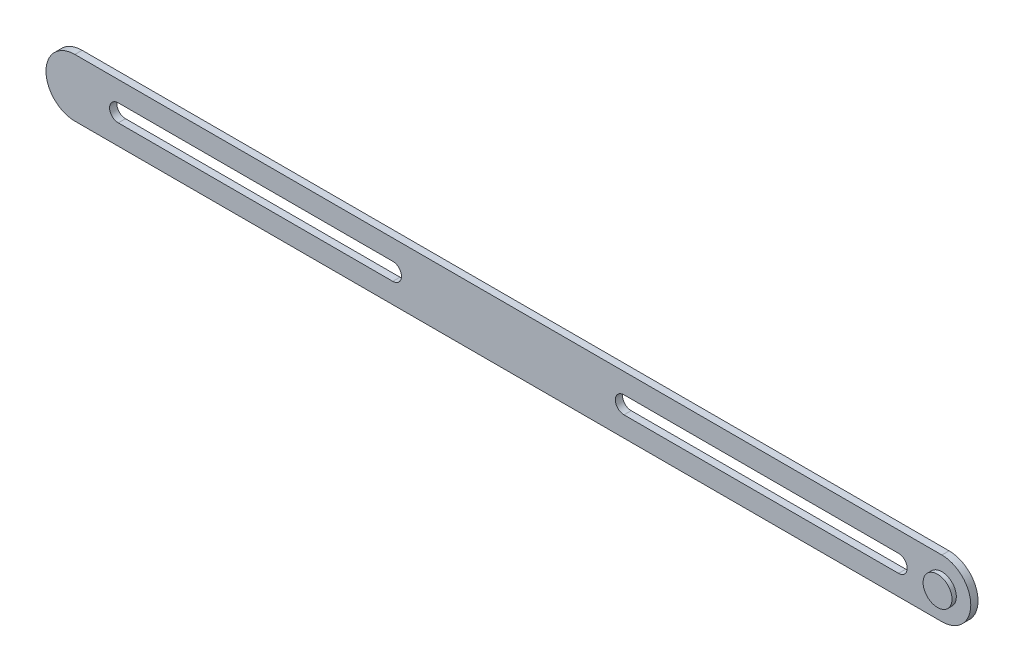
ISO-10303-21;
HEADER;
FILE_DESCRIPTION(('STEP AP214'),'2;1');
FILE_NAME('part.step','',(''),(''),'','','');
FILE_SCHEMA(('AUTOMOTIVE_DESIGN { 1 0 10303 214 1 1 1 1 }'));
ENDSEC;
DATA;
#1=APPLICATION_CONTEXT('core data for automotive mechanical design processes');
#2=APPLICATION_PROTOCOL_DEFINITION('international standard','automotive_design',2000,#1);
#3=PRODUCT_CONTEXT('',#1,'mechanical');
#4=PRODUCT('Part','Part','',(#3));
#5=PRODUCT_RELATED_PRODUCT_CATEGORY('part','',(#4));
#6=PRODUCT_DEFINITION_FORMATION('','',#4);
#7=PRODUCT_DEFINITION_CONTEXT('part definition',#1,'design');
#8=PRODUCT_DEFINITION('design','',#6,#7);
#9=PRODUCT_DEFINITION_SHAPE('','',#8);
#10=(LENGTH_UNIT() NAMED_UNIT(*) SI_UNIT(.MILLI.,.METRE.));
#11=(NAMED_UNIT(*) PLANE_ANGLE_UNIT() SI_UNIT($,.RADIAN.));
#12=(NAMED_UNIT(*) SI_UNIT($,.STERADIAN.) SOLID_ANGLE_UNIT());
#13=UNCERTAINTY_MEASURE_WITH_UNIT(LENGTH_MEASURE(1.E-05),#10,'distance_accuracy_value','');
#14=(GEOMETRIC_REPRESENTATION_CONTEXT(3) GLOBAL_UNCERTAINTY_ASSIGNED_CONTEXT((#13)) GLOBAL_UNIT_ASSIGNED_CONTEXT((#10,
#11,#12)) REPRESENTATION_CONTEXT('',''));
#15=CARTESIAN_POINT('',(0.,0.,0.));
#16=DIRECTION('',(0.,0.,1.));
#17=DIRECTION('',(1.,0.,0.));
#18=AXIS2_PLACEMENT_3D('',#15,#16,#17);
#19=CARTESIAN_POINT('',(0.,0.,4.));
#20=DIRECTION('',(0.,0.,-1.));
#21=DIRECTION('',(-1.,0.,0.));
#22=AXIS2_PLACEMENT_3D('',#19,#20,#21);
#23=CYLINDRICAL_SURFACE('',#22,2.5);
#24=CARTESIAN_POINT('',(0.,0.,4.));
#25=DIRECTION('',(0.,0.,1.));
#26=DIRECTION('',(1.,0.,0.));
#27=AXIS2_PLACEMENT_3D('',#24,#25,#26);
#28=CIRCLE('',#27,2.5);
#29=CARTESIAN_POINT('',(2.5,0.,4.));
#30=VERTEX_POINT('',#29);
#31=EDGE_CURVE('E41',#30,#30,#28,.T.);
#32=ORIENTED_EDGE('',*,*,#31,.F.);
#33=EDGE_LOOP('',(#32));
#34=FACE_BOUND('',#33,.T.);
#35=CARTESIAN_POINT('',(0.,0.,0.));
#36=DIRECTION('',(0.,0.,1.));
#37=DIRECTION('',(1.,0.,0.));
#38=AXIS2_PLACEMENT_3D('',#35,#36,#37);
#39=CIRCLE('',#38,2.5);
#40=CARTESIAN_POINT('',(2.5,0.,0.));
#41=VERTEX_POINT('',#40);
#42=EDGE_CURVE('E220',#41,#41,#39,.T.);
#43=ORIENTED_EDGE('',*,*,#42,.T.);
#44=EDGE_LOOP('',(#43));
#45=FACE_BOUND('',#44,.T.);
#46=ADVANCED_FACE('F33',(#34,#45),#23,.T.);
#47=CARTESIAN_POINT('',(0.,0.,0.));
#48=DIRECTION('',(0.,0.,1.));
#49=DIRECTION('',(1.,0.,0.));
#50=AXIS2_PLACEMENT_3D('',#47,#48,#49);
#51=PLANE('',#50);
#52=ORIENTED_EDGE('',*,*,#42,.F.);
#53=EDGE_LOOP('',(#52));
#54=FACE_BOUND('',#53,.T.);
#55=ADVANCED_FACE('F226',(#54),#51,.F.);
#56=CARTESIAN_POINT('',(0.,0.,6.5));
#57=DIRECTION('',(0.,0.,1.));
#58=DIRECTION('',(1.,0.,0.));
#59=AXIS2_PLACEMENT_3D('',#56,#57,#58);
#60=PLANE('',#59);
#61=CARTESIAN_POINT('',(300.,1.46957615897682E-13,6.5));
#62=DIRECTION('',(0.,0.,1.));
#63=DIRECTION('',(1.,0.,0.));
#64=AXIS2_PLACEMENT_3D('',#61,#62,#63);
#65=CIRCLE('',#64,4.99999999999999);
#66=CARTESIAN_POINT('',(305.,1.46957615897682E-13,6.5));
#67=VERTEX_POINT('',#66);
#68=EDGE_CURVE('E11',#67,#67,#65,.T.);
#69=ORIENTED_EDGE('',*,*,#68,.F.);
#70=EDGE_LOOP('',(#69));
#71=FACE_BOUND('',#70,.T.);
#72=CARTESIAN_POINT('',(0.,0.,6.5));
#73=DIRECTION('',(0.,0.,1.));
#74=DIRECTION('',(1.,0.,0.));
#75=AXIS2_PLACEMENT_3D('',#72,#73,#74);
#76=CIRCLE('',#75,10.);
#77=CARTESIAN_POINT('',(0.,10.,6.5));
#78=VERTEX_POINT('',#77);
#79=CARTESIAN_POINT('',(0.,-10.,6.5));
#80=VERTEX_POINT('',#79);
#81=EDGE_CURVE('E191',#78,#80,#76,.T.);
#82=ORIENTED_EDGE('',*,*,#81,.T.);
#83=DIRECTION('',(1.,0.,0.));
#84=VECTOR('',#83,1.);
#85=CARTESIAN_POINT('',(0.,-10.,6.5));
#86=LINE('',#85,#84);
#87=CARTESIAN_POINT('',(300.,-9.99999999999985,6.5));
#88=VERTEX_POINT('',#87);
#89=EDGE_CURVE('E194',#80,#88,#86,.T.);
#90=ORIENTED_EDGE('',*,*,#89,.T.);
#91=CARTESIAN_POINT('',(300.,1.46957615897682E-13,6.5));
#92=DIRECTION('',(0.,0.,1.));
#93=DIRECTION('',(1.,0.,0.));
#94=AXIS2_PLACEMENT_3D('',#91,#92,#93);
#95=CIRCLE('',#94,10.);
#96=CARTESIAN_POINT('',(300.,10.0000000000001,6.5));
#97=VERTEX_POINT('',#96);
#98=EDGE_CURVE('E197',#88,#97,#95,.T.);
#99=ORIENTED_EDGE('',*,*,#98,.T.);
#100=DIRECTION('',(-1.,0.,0.));
#101=VECTOR('',#100,1.);
#102=CARTESIAN_POINT('',(0.,10.,6.5));
#103=LINE('',#102,#101);
#104=EDGE_CURVE('E199',#97,#78,#103,.T.);
#105=ORIENTED_EDGE('',*,*,#104,.T.);
#106=EDGE_LOOP('',(#82,#90,#99,#105));
#107=FACE_BOUND('',#106,.T.);
#108=DIRECTION('',(1.,0.,0.));
#109=VECTOR('',#108,1.);
#110=CARTESIAN_POINT('',(15.,-3.,6.5));
#111=LINE('',#110,#109);
#112=CARTESIAN_POINT('',(15.,-3.,6.5));
#113=VERTEX_POINT('',#112);
#114=CARTESIAN_POINT('',(110.,-2.99999999999997,6.5));
#115=VERTEX_POINT('',#114);
#116=EDGE_CURVE('E162',#113,#115,#111,.T.);
#117=ORIENTED_EDGE('',*,*,#116,.F.);
#118=CARTESIAN_POINT('',(15.,0.,6.5));
#119=DIRECTION('',(0.,0.,1.));
#120=DIRECTION('',(1.,0.,0.));
#121=AXIS2_PLACEMENT_3D('',#118,#119,#120);
#122=CIRCLE('',#121,3.);
#123=CARTESIAN_POINT('',(15.,3.,6.5));
#124=VERTEX_POINT('',#123);
#125=EDGE_CURVE('E160',#124,#113,#122,.T.);
#126=ORIENTED_EDGE('',*,*,#125,.F.);
#127=DIRECTION('',(-1.,0.,0.));
#128=VECTOR('',#127,1.);
#129=CARTESIAN_POINT('',(15.,3.,6.5));
#130=LINE('',#129,#128);
#131=CARTESIAN_POINT('',(110.,3.00000000000003,6.5));
#132=VERTEX_POINT('',#131);
#133=EDGE_CURVE('E168',#132,#124,#130,.T.);
#134=ORIENTED_EDGE('',*,*,#133,.F.);
#135=CARTESIAN_POINT('',(110.,0.,6.5));
#136=DIRECTION('',(0.,0.,1.));
#137=DIRECTION('',(1.,0.,0.));
#138=AXIS2_PLACEMENT_3D('',#135,#136,#137);
#139=CIRCLE('',#138,3.);
#140=EDGE_CURVE('E165',#115,#132,#139,.T.);
#141=ORIENTED_EDGE('',*,*,#140,.F.);
#142=EDGE_LOOP('',(#117,#126,#134,#141));
#143=FACE_BOUND('',#142,.T.);
#144=DIRECTION('',(-1.,0.,0.));
#145=VECTOR('',#144,1.);
#146=CARTESIAN_POINT('',(285.,2.99999999999995,6.5));
#147=LINE('',#146,#145);
#148=CARTESIAN_POINT('',(285.,2.99999999999995,6.5));
#149=VERTEX_POINT('',#148);
#150=CARTESIAN_POINT('',(190.,2.99999999999995,6.5));
#151=VERTEX_POINT('',#150);
#152=EDGE_CURVE('E131',#149,#151,#147,.T.);
#153=ORIENTED_EDGE('',*,*,#152,.F.);
#154=CARTESIAN_POINT('',(285.,0.,6.5));
#155=DIRECTION('',(0.,0.,1.));
#156=DIRECTION('',(-1.,0.,0.));
#157=AXIS2_PLACEMENT_3D('',#154,#155,#156);
#158=CIRCLE('',#157,2.99999999999987);
#159=CARTESIAN_POINT('',(285.,-2.99999999999979,6.5));
#160=VERTEX_POINT('',#159);
#161=EDGE_CURVE('E123',#160,#149,#158,.T.);
#162=ORIENTED_EDGE('',*,*,#161,.F.);
#163=DIRECTION('',(1.,0.,0.));
#164=VECTOR('',#163,1.);
#165=CARTESIAN_POINT('',(285.,-2.99999999999979,6.5));
#166=LINE('',#165,#164);
#167=CARTESIAN_POINT('',(190.,-2.99999999999987,6.5));
#168=VERTEX_POINT('',#167);
#169=EDGE_CURVE('E146',#168,#160,#166,.T.);
#170=ORIENTED_EDGE('',*,*,#169,.F.);
#171=CARTESIAN_POINT('',(190.,0.,6.5));
#172=DIRECTION('',(0.,0.,1.));
#173=DIRECTION('',(-1.,0.,0.));
#174=AXIS2_PLACEMENT_3D('',#171,#172,#173);
#175=CIRCLE('',#174,2.99999999999991);
#176=EDGE_CURVE('E144',#151,#168,#175,.T.);
#177=ORIENTED_EDGE('',*,*,#176,.F.);
#178=EDGE_LOOP('',(#153,#162,#170,#177));
#179=FACE_BOUND('',#178,.T.);
#180=ADVANCED_FACE('F143',(#71,#107,#143,#179),#60,.T.);
#181=CARTESIAN_POINT('',(0.,0.,4.));
#182=DIRECTION('',(0.,0.,1.));
#183=DIRECTION('',(1.,0.,0.));
#184=AXIS2_PLACEMENT_3D('',#181,#182,#183);
#185=PLANE('',#184);
#186=CARTESIAN_POINT('',(300.,1.46957615897682E-13,4.));
#187=DIRECTION('',(0.,0.,1.));
#188=DIRECTION('',(1.,0.,0.));
#189=AXIS2_PLACEMENT_3D('',#186,#187,#188);
#190=CIRCLE('',#189,4.99999999999999);
#191=CARTESIAN_POINT('',(305.,1.46957615897682E-13,4.));
#192=VERTEX_POINT('',#191);
#193=EDGE_CURVE('E36',#192,#192,#190,.T.);
#194=ORIENTED_EDGE('',*,*,#193,.T.);
#195=EDGE_LOOP('',(#194));
#196=FACE_BOUND('',#195,.T.);
#197=ORIENTED_EDGE('',*,*,#31,.T.);
#198=EDGE_LOOP('',(#197));
#199=FACE_BOUND('',#198,.T.);
#200=CARTESIAN_POINT('',(15.,0.,4.));
#201=DIRECTION('',(0.,0.,1.));
#202=DIRECTION('',(1.,0.,0.));
#203=AXIS2_PLACEMENT_3D('',#200,#201,#202);
#204=CIRCLE('',#203,3.);
#205=CARTESIAN_POINT('',(15.,3.,4.));
#206=VERTEX_POINT('',#205);
#207=CARTESIAN_POINT('',(15.,-3.,4.));
#208=VERTEX_POINT('',#207);
#209=EDGE_CURVE('E139',#206,#208,#204,.T.);
#210=ORIENTED_EDGE('',*,*,#209,.T.);
#211=DIRECTION('',(1.,0.,0.));
#212=VECTOR('',#211,1.);
#213=CARTESIAN_POINT('',(15.,-3.,4.));
#214=LINE('',#213,#212);
#215=CARTESIAN_POINT('',(110.,-2.99999999999997,4.));
#216=VERTEX_POINT('',#215);
#217=EDGE_CURVE('E173',#208,#216,#214,.T.);
#218=ORIENTED_EDGE('',*,*,#217,.T.);
#219=CARTESIAN_POINT('',(110.,0.,4.));
#220=DIRECTION('',(0.,0.,1.));
#221=DIRECTION('',(1.,0.,0.));
#222=AXIS2_PLACEMENT_3D('',#219,#220,#221);
#223=CIRCLE('',#222,3.);
#224=CARTESIAN_POINT('',(110.,3.00000000000003,4.));
#225=VERTEX_POINT('',#224);
#226=EDGE_CURVE('E176',#216,#225,#223,.T.);
#227=ORIENTED_EDGE('',*,*,#226,.T.);
#228=DIRECTION('',(-1.,0.,0.));
#229=VECTOR('',#228,1.);
#230=CARTESIAN_POINT('',(15.,3.,4.));
#231=LINE('',#230,#229);
#232=EDGE_CURVE('E163',#225,#206,#231,.T.);
#233=ORIENTED_EDGE('',*,*,#232,.T.);
#234=EDGE_LOOP('',(#210,#218,#227,#233));
#235=FACE_BOUND('',#234,.T.);
#236=CARTESIAN_POINT('',(0.,0.,4.));
#237=DIRECTION('',(0.,0.,1.));
#238=DIRECTION('',(1.,0.,0.));
#239=AXIS2_PLACEMENT_3D('',#236,#237,#238);
#240=CIRCLE('',#239,10.);
#241=CARTESIAN_POINT('',(0.,10.,4.));
#242=VERTEX_POINT('',#241);
#243=CARTESIAN_POINT('',(0.,-10.,4.));
#244=VERTEX_POINT('',#243);
#245=EDGE_CURVE('E190',#242,#244,#240,.T.);
#246=ORIENTED_EDGE('',*,*,#245,.F.);
#247=DIRECTION('',(-1.,0.,0.));
#248=VECTOR('',#247,1.);
#249=CARTESIAN_POINT('',(0.,10.,4.));
#250=LINE('',#249,#248);
#251=CARTESIAN_POINT('',(300.,10.0000000000001,4.));
#252=VERTEX_POINT('',#251);
#253=EDGE_CURVE('E195',#252,#242,#250,.T.);
#254=ORIENTED_EDGE('',*,*,#253,.F.);
#255=CARTESIAN_POINT('',(300.,1.46957615897682E-13,4.));
#256=DIRECTION('',(0.,0.,1.));
#257=DIRECTION('',(1.,0.,0.));
#258=AXIS2_PLACEMENT_3D('',#255,#256,#257);
#259=CIRCLE('',#258,10.);
#260=CARTESIAN_POINT('',(300.,-9.99999999999985,4.));
#261=VERTEX_POINT('',#260);
#262=EDGE_CURVE('E206',#261,#252,#259,.T.);
#263=ORIENTED_EDGE('',*,*,#262,.F.);
#264=DIRECTION('',(1.,0.,0.));
#265=VECTOR('',#264,1.);
#266=CARTESIAN_POINT('',(0.,-10.,4.));
#267=LINE('',#266,#265);
#268=EDGE_CURVE('E204',#244,#261,#267,.T.);
#269=ORIENTED_EDGE('',*,*,#268,.F.);
#270=EDGE_LOOP('',(#246,#254,#263,#269));
#271=FACE_BOUND('',#270,.T.);
#272=CARTESIAN_POINT('',(285.,0.,4.));
#273=DIRECTION('',(0.,0.,1.));
#274=DIRECTION('',(-1.,0.,0.));
#275=AXIS2_PLACEMENT_3D('',#272,#273,#274);
#276=CIRCLE('',#275,2.99999999999987);
#277=CARTESIAN_POINT('',(285.,-2.99999999999979,4.));
#278=VERTEX_POINT('',#277);
#279=CARTESIAN_POINT('',(285.,2.99999999999995,4.));
#280=VERTEX_POINT('',#279);
#281=EDGE_CURVE('E57',#278,#280,#276,.T.);
#282=ORIENTED_EDGE('',*,*,#281,.T.);
#283=DIRECTION('',(-1.,0.,0.));
#284=VECTOR('',#283,1.);
#285=CARTESIAN_POINT('',(285.,2.99999999999995,4.));
#286=LINE('',#285,#284);
#287=CARTESIAN_POINT('',(190.,2.99999999999995,4.));
#288=VERTEX_POINT('',#287);
#289=EDGE_CURVE('E138',#280,#288,#286,.T.);
#290=ORIENTED_EDGE('',*,*,#289,.T.);
#291=CARTESIAN_POINT('',(190.,0.,4.));
#292=DIRECTION('',(0.,0.,1.));
#293=DIRECTION('',(-1.,0.,0.));
#294=AXIS2_PLACEMENT_3D('',#291,#292,#293);
#295=CIRCLE('',#294,2.99999999999991);
#296=CARTESIAN_POINT('',(190.,-2.99999999999987,4.));
#297=VERTEX_POINT('',#296);
#298=EDGE_CURVE('E152',#288,#297,#295,.T.);
#299=ORIENTED_EDGE('',*,*,#298,.T.);
#300=DIRECTION('',(1.,0.,0.));
#301=VECTOR('',#300,1.);
#302=CARTESIAN_POINT('',(285.,-2.99999999999979,4.));
#303=LINE('',#302,#301);
#304=EDGE_CURVE('E132',#297,#278,#303,.T.);
#305=ORIENTED_EDGE('',*,*,#304,.T.);
#306=EDGE_LOOP('',(#282,#290,#299,#305));
#307=FACE_BOUND('',#306,.T.);
#308=ADVANCED_FACE('F232',(#196,#199,#235,#271,#307),#185,.F.);
#309=CARTESIAN_POINT('',(0.,0.,6.5));
#310=DIRECTION('',(0.,0.,-1.));
#311=DIRECTION('',(-1.,0.,0.));
#312=AXIS2_PLACEMENT_3D('',#309,#310,#311);
#313=CYLINDRICAL_SURFACE('',#312,10.);
#314=ORIENTED_EDGE('',*,*,#245,.T.);
#315=DIRECTION('',(0.,0.,-1.));
#316=VECTOR('',#315,1.);
#317=CARTESIAN_POINT('',(0.,-10.,6.5));
#318=LINE('',#317,#316);
#319=EDGE_CURVE('E217',#80,#244,#318,.T.);
#320=ORIENTED_EDGE('',*,*,#319,.F.);
#321=ORIENTED_EDGE('',*,*,#81,.F.);
#322=DIRECTION('',(0.,0.,-1.));
#323=VECTOR('',#322,1.);
#324=CARTESIAN_POINT('',(0.,10.,6.5));
#325=LINE('',#324,#323);
#326=EDGE_CURVE('E201',#78,#242,#325,.T.);
#327=ORIENTED_EDGE('',*,*,#326,.T.);
#328=EDGE_LOOP('',(#314,#320,#321,#327));
#329=FACE_BOUND('',#328,.T.);
#330=ADVANCED_FACE('F237',(#329),#313,.T.);
#331=CARTESIAN_POINT('',(0.,-10.,6.5));
#332=DIRECTION('',(0.,1.,0.));
#333=DIRECTION('',(-1.,0.,0.));
#334=AXIS2_PLACEMENT_3D('',#331,#332,#333);
#335=PLANE('',#334);
#336=ORIENTED_EDGE('',*,*,#268,.T.);
#337=DIRECTION('',(0.,0.,-1.));
#338=VECTOR('',#337,1.);
#339=CARTESIAN_POINT('',(300.,-9.99999999999985,6.5));
#340=LINE('',#339,#338);
#341=EDGE_CURVE('E214',#88,#261,#340,.T.);
#342=ORIENTED_EDGE('',*,*,#341,.F.);
#343=ORIENTED_EDGE('',*,*,#89,.F.);
#344=ORIENTED_EDGE('',*,*,#319,.T.);
#345=EDGE_LOOP('',(#336,#342,#343,#344));
#346=FACE_BOUND('',#345,.T.);
#347=ADVANCED_FACE('F240',(#346),#335,.F.);
#348=CARTESIAN_POINT('',(300.,1.46957615897682E-13,6.5));
#349=DIRECTION('',(0.,0.,-1.));
#350=DIRECTION('',(-1.,0.,0.));
#351=AXIS2_PLACEMENT_3D('',#348,#349,#350);
#352=CYLINDRICAL_SURFACE('',#351,10.);
#353=ORIENTED_EDGE('',*,*,#262,.T.);
#354=DIRECTION('',(0.,0.,-1.));
#355=VECTOR('',#354,1.);
#356=CARTESIAN_POINT('',(300.,10.0000000000001,6.5));
#357=LINE('',#356,#355);
#358=EDGE_CURVE('E211',#97,#252,#357,.T.);
#359=ORIENTED_EDGE('',*,*,#358,.F.);
#360=ORIENTED_EDGE('',*,*,#98,.F.);
#361=ORIENTED_EDGE('',*,*,#341,.T.);
#362=EDGE_LOOP('',(#353,#359,#360,#361));
#363=FACE_BOUND('',#362,.T.);
#364=ADVANCED_FACE('F244',(#363),#352,.T.);
#365=CARTESIAN_POINT('',(0.,10.,6.5));
#366=DIRECTION('',(0.,-1.,0.));
#367=DIRECTION('',(1.,0.,0.));
#368=AXIS2_PLACEMENT_3D('',#365,#366,#367);
#369=PLANE('',#368);
#370=ORIENTED_EDGE('',*,*,#253,.T.);
#371=ORIENTED_EDGE('',*,*,#326,.F.);
#372=ORIENTED_EDGE('',*,*,#104,.F.);
#373=ORIENTED_EDGE('',*,*,#358,.T.);
#374=EDGE_LOOP('',(#370,#371,#372,#373));
#375=FACE_BOUND('',#374,.T.);
#376=ADVANCED_FACE('F248',(#375),#369,.F.);
#377=CARTESIAN_POINT('',(15.,0.,6.5));
#378=DIRECTION('',(0.,0.,-1.));
#379=DIRECTION('',(-1.,0.,0.));
#380=AXIS2_PLACEMENT_3D('',#377,#378,#379);
#381=CYLINDRICAL_SURFACE('',#380,3.);
#382=ORIENTED_EDGE('',*,*,#209,.F.);
#383=DIRECTION('',(0.,0.,-1.));
#384=VECTOR('',#383,1.);
#385=CARTESIAN_POINT('',(15.,3.,6.5));
#386=LINE('',#385,#384);
#387=EDGE_CURVE('E170',#124,#206,#386,.T.);
#388=ORIENTED_EDGE('',*,*,#387,.F.);
#389=ORIENTED_EDGE('',*,*,#125,.T.);
#390=DIRECTION('',(0.,0.,-1.));
#391=VECTOR('',#390,1.);
#392=CARTESIAN_POINT('',(15.,-3.,6.5));
#393=LINE('',#392,#391);
#394=EDGE_CURVE('E187',#113,#208,#393,.T.);
#395=ORIENTED_EDGE('',*,*,#394,.T.);
#396=EDGE_LOOP('',(#382,#388,#389,#395));
#397=FACE_BOUND('',#396,.T.);
#398=ADVANCED_FACE('F252',(#397),#381,.F.);
#399=CARTESIAN_POINT('',(15.,-3.,6.5));
#400=DIRECTION('',(0.,1.,0.));
#401=DIRECTION('',(-1.,0.,0.));
#402=AXIS2_PLACEMENT_3D('',#399,#400,#401);
#403=PLANE('',#402);
#404=ORIENTED_EDGE('',*,*,#217,.F.);
#405=ORIENTED_EDGE('',*,*,#394,.F.);
#406=ORIENTED_EDGE('',*,*,#116,.T.);
#407=DIRECTION('',(0.,0.,-1.));
#408=VECTOR('',#407,1.);
#409=CARTESIAN_POINT('',(110.,-2.99999999999997,6.5));
#410=LINE('',#409,#408);
#411=EDGE_CURVE('E185',#115,#216,#410,.T.);
#412=ORIENTED_EDGE('',*,*,#411,.T.);
#413=EDGE_LOOP('',(#404,#405,#406,#412));
#414=FACE_BOUND('',#413,.T.);
#415=ADVANCED_FACE('F259',(#414),#403,.T.);
#416=CARTESIAN_POINT('',(110.,0.,6.5));
#417=DIRECTION('',(0.,0.,-1.));
#418=DIRECTION('',(-1.,0.,0.));
#419=AXIS2_PLACEMENT_3D('',#416,#417,#418);
#420=CYLINDRICAL_SURFACE('',#419,3.);
#421=ORIENTED_EDGE('',*,*,#226,.F.);
#422=ORIENTED_EDGE('',*,*,#411,.F.);
#423=ORIENTED_EDGE('',*,*,#140,.T.);
#424=DIRECTION('',(0.,0.,-1.));
#425=VECTOR('',#424,1.);
#426=CARTESIAN_POINT('',(110.,3.00000000000003,6.5));
#427=LINE('',#426,#425);
#428=EDGE_CURVE('E183',#132,#225,#427,.T.);
#429=ORIENTED_EDGE('',*,*,#428,.T.);
#430=EDGE_LOOP('',(#421,#422,#423,#429));
#431=FACE_BOUND('',#430,.T.);
#432=ADVANCED_FACE('F263',(#431),#420,.F.);
#433=CARTESIAN_POINT('',(15.,3.,6.5));
#434=DIRECTION('',(0.,-1.,0.));
#435=DIRECTION('',(1.,0.,0.));
#436=AXIS2_PLACEMENT_3D('',#433,#434,#435);
#437=PLANE('',#436);
#438=ORIENTED_EDGE('',*,*,#232,.F.);
#439=ORIENTED_EDGE('',*,*,#428,.F.);
#440=ORIENTED_EDGE('',*,*,#133,.T.);
#441=ORIENTED_EDGE('',*,*,#387,.T.);
#442=EDGE_LOOP('',(#438,#439,#440,#441));
#443=FACE_BOUND('',#442,.T.);
#444=ADVANCED_FACE('F267',(#443),#437,.T.);
#445=CARTESIAN_POINT('',(285.,0.,6.5));
#446=DIRECTION('',(0.,0.,-1.));
#447=DIRECTION('',(-1.,0.,0.));
#448=AXIS2_PLACEMENT_3D('',#445,#446,#447);
#449=CYLINDRICAL_SURFACE('',#448,2.99999999999987);
#450=ORIENTED_EDGE('',*,*,#281,.F.);
#451=DIRECTION('',(0.,0.,-1.));
#452=VECTOR('',#451,1.);
#453=CARTESIAN_POINT('',(285.,-2.99999999999979,6.5));
#454=LINE('',#453,#452);
#455=EDGE_CURVE('E127',#160,#278,#454,.T.);
#456=ORIENTED_EDGE('',*,*,#455,.F.);
#457=ORIENTED_EDGE('',*,*,#161,.T.);
#458=DIRECTION('',(0.,0.,-1.));
#459=VECTOR('',#458,1.);
#460=CARTESIAN_POINT('',(285.,2.99999999999995,6.5));
#461=LINE('',#460,#459);
#462=EDGE_CURVE('E126',#149,#280,#461,.T.);
#463=ORIENTED_EDGE('',*,*,#462,.T.);
#464=EDGE_LOOP('',(#450,#456,#457,#463));
#465=FACE_BOUND('',#464,.T.);
#466=ADVANCED_FACE('F125',(#465),#449,.F.);
#467=CARTESIAN_POINT('',(285.,2.99999999999995,6.5));
#468=DIRECTION('',(0.,-1.,0.));
#469=DIRECTION('',(1.,0.,0.));
#470=AXIS2_PLACEMENT_3D('',#467,#468,#469);
#471=PLANE('',#470);
#472=ORIENTED_EDGE('',*,*,#289,.F.);
#473=ORIENTED_EDGE('',*,*,#462,.F.);
#474=ORIENTED_EDGE('',*,*,#152,.T.);
#475=DIRECTION('',(0.,0.,-1.));
#476=VECTOR('',#475,1.);
#477=CARTESIAN_POINT('',(190.,2.99999999999995,6.5));
#478=LINE('',#477,#476);
#479=EDGE_CURVE('E140',#151,#288,#478,.T.);
#480=ORIENTED_EDGE('',*,*,#479,.T.);
#481=EDGE_LOOP('',(#472,#473,#474,#480));
#482=FACE_BOUND('',#481,.T.);
#483=ADVANCED_FACE('F135',(#482),#471,.T.);
#484=CARTESIAN_POINT('',(190.,0.,6.5));
#485=DIRECTION('',(0.,0.,-1.));
#486=DIRECTION('',(-1.,0.,0.));
#487=AXIS2_PLACEMENT_3D('',#484,#485,#486);
#488=CYLINDRICAL_SURFACE('',#487,2.99999999999991);
#489=ORIENTED_EDGE('',*,*,#298,.F.);
#490=ORIENTED_EDGE('',*,*,#479,.F.);
#491=ORIENTED_EDGE('',*,*,#176,.T.);
#492=DIRECTION('',(0.,0.,-1.));
#493=VECTOR('',#492,1.);
#494=CARTESIAN_POINT('',(190.,-2.99999999999987,6.5));
#495=LINE('',#494,#493);
#496=EDGE_CURVE('E49',#168,#297,#495,.T.);
#497=ORIENTED_EDGE('',*,*,#496,.T.);
#498=EDGE_LOOP('',(#489,#490,#491,#497));
#499=FACE_BOUND('',#498,.T.);
#500=ADVANCED_FACE('F276',(#499),#488,.F.);
#501=CARTESIAN_POINT('',(285.,-2.99999999999979,6.5));
#502=DIRECTION('',(0.,1.,0.));
#503=DIRECTION('',(-1.,0.,0.));
#504=AXIS2_PLACEMENT_3D('',#501,#502,#503);
#505=PLANE('',#504);
#506=ORIENTED_EDGE('',*,*,#304,.F.);
#507=ORIENTED_EDGE('',*,*,#496,.F.);
#508=ORIENTED_EDGE('',*,*,#169,.T.);
#509=ORIENTED_EDGE('',*,*,#455,.T.);
#510=EDGE_LOOP('',(#506,#507,#508,#509));
#511=FACE_BOUND('',#510,.T.);
#512=ADVANCED_FACE('F279',(#511),#505,.T.);
#513=CARTESIAN_POINT('',(300.,1.46957615897682E-13,0.5));
#514=DIRECTION('',(0.,0.,-1.));
#515=DIRECTION('',(-1.,0.,0.));
#516=AXIS2_PLACEMENT_3D('',#513,#514,#515);
#517=PLANE('',#516);
#518=CARTESIAN_POINT('',(300.,1.46957615897682E-13,0.5));
#519=DIRECTION('',(0.,0.,-1.));
#520=DIRECTION('',(-1.,0.,0.));
#521=AXIS2_PLACEMENT_3D('',#518,#519,#520);
#522=CIRCLE('',#521,4.99999999999999);
#523=CARTESIAN_POINT('',(295.,1.46957615897682E-13,0.5));
#524=VERTEX_POINT('',#523);
#525=EDGE_CURVE('E301',#524,#524,#522,.T.);
#526=ORIENTED_EDGE('',*,*,#525,.T.);
#527=EDGE_LOOP('',(#526));
#528=FACE_BOUND('',#527,.T.);
#529=ADVANCED_FACE('F283',(#528),#517,.T.);
#530=CARTESIAN_POINT('',(300.,1.46957615897682E-13,8.));
#531=DIRECTION('',(0.,0.,-1.));
#532=DIRECTION('',(-1.,0.,0.));
#533=AXIS2_PLACEMENT_3D('',#530,#531,#532);
#534=CYLINDRICAL_SURFACE('',#533,4.99999999999999);
#535=ORIENTED_EDGE('',*,*,#525,.F.);
#536=EDGE_LOOP('',(#535));
#537=FACE_BOUND('',#536,.T.);
#538=ORIENTED_EDGE('',*,*,#193,.F.);
#539=EDGE_LOOP('',(#538));
#540=FACE_BOUND('',#539,.T.);
#541=ADVANCED_FACE('F288',(#537,#540),#534,.T.);
#542=ORIENTED_EDGE('',*,*,#68,.T.);
#543=EDGE_LOOP('',(#542));
#544=FACE_BOUND('',#543,.T.);
#545=CARTESIAN_POINT('',(300.,1.46957615897682E-13,8.));
#546=DIRECTION('',(0.,0.,-1.));
#547=DIRECTION('',(-1.,0.,0.));
#548=AXIS2_PLACEMENT_3D('',#545,#546,#547);
#549=CIRCLE('',#548,4.99999999999999);
#550=CARTESIAN_POINT('',(295.,1.46957615897682E-13,8.));
#551=VERTEX_POINT('',#550);
#552=EDGE_CURVE('E302',#551,#551,#549,.T.);
#553=ORIENTED_EDGE('',*,*,#552,.T.);
#554=EDGE_LOOP('',(#553));
#555=FACE_BOUND('',#554,.T.);
#556=ADVANCED_FACE('F284',(#544,#555),#534,.T.);
#557=CARTESIAN_POINT('',(300.,1.46957615897682E-13,8.));
#558=DIRECTION('',(0.,0.,-1.));
#559=DIRECTION('',(-1.,0.,0.));
#560=AXIS2_PLACEMENT_3D('',#557,#558,#559);
#561=PLANE('',#560);
#562=ORIENTED_EDGE('',*,*,#552,.F.);
#563=EDGE_LOOP('',(#562));
#564=FACE_BOUND('',#563,.T.);
#565=ADVANCED_FACE('F287',(#564),#561,.F.);
#566=CLOSED_SHELL('',(#46,#55,#180,#308,#330,#347,#364,#376,#398,#415,#432,#444,#466,#483,#500,
#512,#529,#541,#556,#565));
#567=MANIFOLD_SOLID_BREP('B2',#566);
#568=ADVANCED_BREP_SHAPE_REPRESENTATION('',(#18,#567),#14);
#569=SHAPE_DEFINITION_REPRESENTATION(#9,#568);
ENDSEC;
END-ISO-10303-21;
